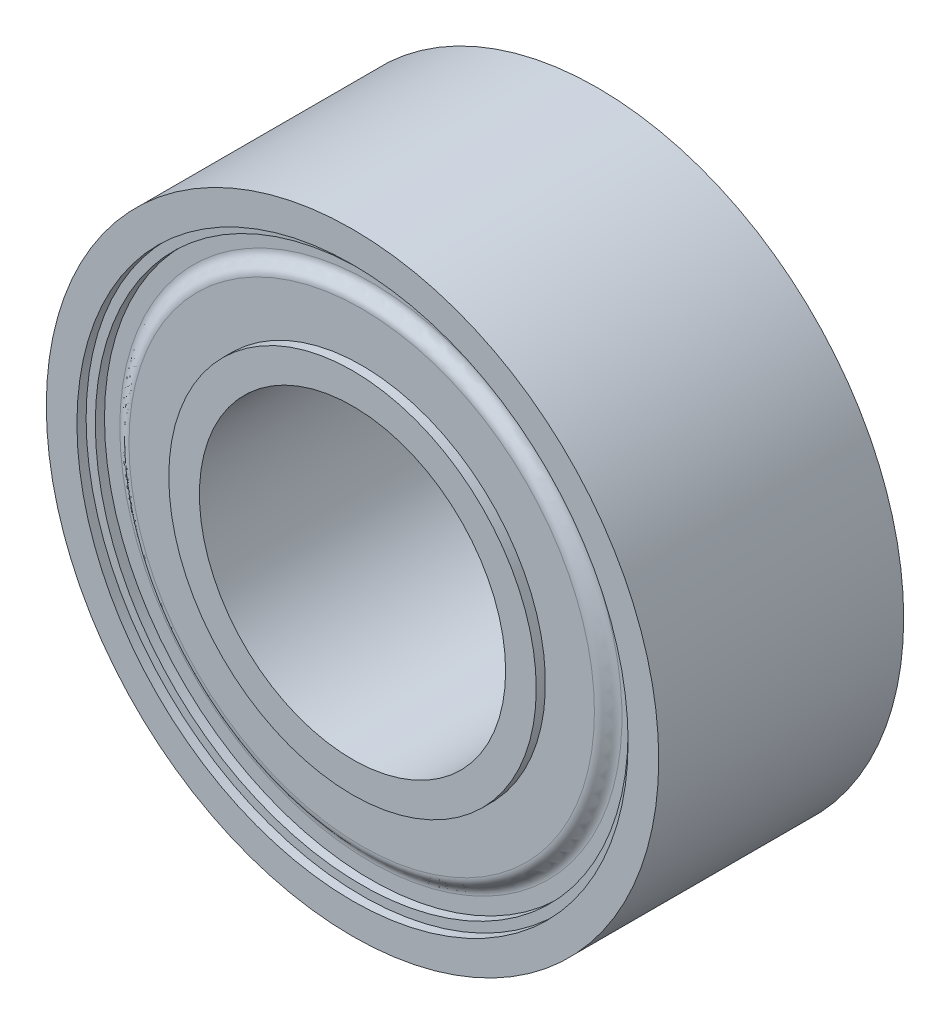
ISO-10303-21;
HEADER;
FILE_DESCRIPTION(('STEP AP214'),'2;1');
FILE_NAME('part.step','',(''),(''),'','','');
FILE_SCHEMA(('AUTOMOTIVE_DESIGN { 1 0 10303 214 1 1 1 1 }'));
ENDSEC;
DATA;
#1=APPLICATION_CONTEXT('core data for automotive mechanical design processes');
#2=APPLICATION_PROTOCOL_DEFINITION('international standard','automotive_design',2000,#1);
#3=PRODUCT_CONTEXT('',#1,'mechanical');
#4=PRODUCT('Part','Part','',(#3));
#5=PRODUCT_RELATED_PRODUCT_CATEGORY('part','',(#4));
#6=PRODUCT_DEFINITION_FORMATION('','',#4);
#7=PRODUCT_DEFINITION_CONTEXT('part definition',#1,'design');
#8=PRODUCT_DEFINITION('design','',#6,#7);
#9=PRODUCT_DEFINITION_SHAPE('','',#8);
#10=(LENGTH_UNIT() NAMED_UNIT(*) SI_UNIT(.MILLI.,.METRE.));
#11=(NAMED_UNIT(*) PLANE_ANGLE_UNIT() SI_UNIT($,.RADIAN.));
#12=(NAMED_UNIT(*) SI_UNIT($,.STERADIAN.) SOLID_ANGLE_UNIT());
#13=UNCERTAINTY_MEASURE_WITH_UNIT(LENGTH_MEASURE(1.E-05),#10,'distance_accuracy_value','');
#14=(GEOMETRIC_REPRESENTATION_CONTEXT(3) GLOBAL_UNCERTAINTY_ASSIGNED_CONTEXT((#13)) GLOBAL_UNIT_ASSIGNED_CONTEXT((#10,
#11,#12)) REPRESENTATION_CONTEXT('',''));
#15=CARTESIAN_POINT('',(0.,0.,0.));
#16=DIRECTION('',(0.,0.,1.));
#17=DIRECTION('',(1.,0.,0.));
#18=AXIS2_PLACEMENT_3D('',#15,#16,#17);
#19=CARTESIAN_POINT('',(0.,0.,2.));
#20=DIRECTION('',(0.,0.,-1.));
#21=DIRECTION('',(-1.,0.,0.));
#22=AXIS2_PLACEMENT_3D('',#19,#20,#21);
#23=CYLINDRICAL_SURFACE('',#22,4.5);
#24=CARTESIAN_POINT('',(0.,0.,-2.));
#25=DIRECTION('',(0.,0.,1.));
#26=DIRECTION('',(1.,0.,0.));
#27=AXIS2_PLACEMENT_3D('',#24,#25,#26);
#28=CIRCLE('',#27,4.5);
#29=CARTESIAN_POINT('',(4.5,0.,-2.));
#30=VERTEX_POINT('',#29);
#31=EDGE_CURVE('E63',#30,#30,#28,.T.);
#32=ORIENTED_EDGE('',*,*,#31,.F.);
#33=EDGE_LOOP('',(#32));
#34=FACE_BOUND('',#33,.T.);
#35=CARTESIAN_POINT('',(0.,0.,-1.85));
#36=DIRECTION('',(0.,0.,-1.));
#37=DIRECTION('',(-1.,0.,0.));
#38=AXIS2_PLACEMENT_3D('',#35,#36,#37);
#39=CIRCLE('',#38,4.5);
#40=CARTESIAN_POINT('',(-4.5,0.,-1.85));
#41=VERTEX_POINT('',#40);
#42=EDGE_CURVE('E104',#41,#41,#39,.T.);
#43=ORIENTED_EDGE('',*,*,#42,.F.);
#44=EDGE_LOOP('',(#43));
#45=FACE_BOUND('',#44,.T.);
#46=ADVANCED_FACE('F47',(#34,#45),#23,.F.);
#47=CARTESIAN_POINT('',(0.,0.,2.));
#48=DIRECTION('',(0.,0.,1.));
#49=DIRECTION('',(1.,0.,0.));
#50=AXIS2_PLACEMENT_3D('',#47,#48,#49);
#51=CIRCLE('',#50,4.5);
#52=CARTESIAN_POINT('',(4.5,0.,2.));
#53=VERTEX_POINT('',#52);
#54=EDGE_CURVE('E55',#53,#53,#51,.T.);
#55=ORIENTED_EDGE('',*,*,#54,.T.);
#56=EDGE_LOOP('',(#55));
#57=FACE_BOUND('',#56,.T.);
#58=CARTESIAN_POINT('',(0.,0.,1.85));
#59=DIRECTION('',(0.,0.,-1.));
#60=DIRECTION('',(-1.,0.,0.));
#61=AXIS2_PLACEMENT_3D('',#58,#59,#60);
#62=CIRCLE('',#61,4.5);
#63=CARTESIAN_POINT('',(-4.5,0.,1.85));
#64=VERTEX_POINT('',#63);
#65=EDGE_CURVE('E108',#64,#64,#62,.T.);
#66=ORIENTED_EDGE('',*,*,#65,.T.);
#67=EDGE_LOOP('',(#66));
#68=FACE_BOUND('',#67,.T.);
#69=ADVANCED_FACE('F152',(#57,#68),#23,.F.);
#70=CARTESIAN_POINT('',(0.,0.,2.));
#71=DIRECTION('',(0.,0.,-1.));
#72=DIRECTION('',(-1.,0.,0.));
#73=AXIS2_PLACEMENT_3D('',#70,#71,#72);
#74=CYLINDRICAL_SURFACE('',#73,5.);
#75=CARTESIAN_POINT('',(0.,0.,2.));
#76=DIRECTION('',(0.,0.,1.));
#77=DIRECTION('',(1.,0.,0.));
#78=AXIS2_PLACEMENT_3D('',#75,#76,#77);
#79=CIRCLE('',#78,5.);
#80=CARTESIAN_POINT('',(5.,0.,2.));
#81=VERTEX_POINT('',#80);
#82=EDGE_CURVE('E11',#81,#81,#79,.T.);
#83=ORIENTED_EDGE('',*,*,#82,.F.);
#84=EDGE_LOOP('',(#83));
#85=FACE_BOUND('',#84,.T.);
#86=CARTESIAN_POINT('',(0.,0.,-2.));
#87=DIRECTION('',(0.,0.,1.));
#88=DIRECTION('',(1.,0.,0.));
#89=AXIS2_PLACEMENT_3D('',#86,#87,#88);
#90=CIRCLE('',#89,5.);
#91=CARTESIAN_POINT('',(5.,0.,-2.));
#92=VERTEX_POINT('',#91);
#93=EDGE_CURVE('E50',#92,#92,#90,.T.);
#94=ORIENTED_EDGE('',*,*,#93,.T.);
#95=EDGE_LOOP('',(#94));
#96=FACE_BOUND('',#95,.T.);
#97=ADVANCED_FACE('F148',(#85,#96),#74,.T.);
#98=CARTESIAN_POINT('',(0.,0.,2.));
#99=DIRECTION('',(0.,0.,1.));
#100=DIRECTION('',(1.,0.,0.));
#101=AXIS2_PLACEMENT_3D('',#98,#99,#100);
#102=PLANE('',#101);
#103=ORIENTED_EDGE('',*,*,#54,.F.);
#104=EDGE_LOOP('',(#103));
#105=FACE_BOUND('',#104,.T.);
#106=ORIENTED_EDGE('',*,*,#82,.T.);
#107=EDGE_LOOP('',(#106));
#108=FACE_BOUND('',#107,.T.);
#109=ADVANCED_FACE('F145',(#105,#108),#102,.T.);
#110=CARTESIAN_POINT('',(0.,0.,-2.));
#111=DIRECTION('',(0.,0.,1.));
#112=DIRECTION('',(1.,0.,0.));
#113=AXIS2_PLACEMENT_3D('',#110,#111,#112);
#114=PLANE('',#113);
#115=ORIENTED_EDGE('',*,*,#31,.T.);
#116=EDGE_LOOP('',(#115));
#117=FACE_BOUND('',#116,.T.);
#118=ORIENTED_EDGE('',*,*,#93,.F.);
#119=EDGE_LOOP('',(#118));
#120=FACE_BOUND('',#119,.T.);
#121=ADVANCED_FACE('F143',(#117,#120),#114,.F.);
#122=CARTESIAN_POINT('',(0.,0.,-2.));
#123=DIRECTION('',(0.,0.,-1.));
#124=DIRECTION('',(-1.,0.,0.));
#125=AXIS2_PLACEMENT_3D('',#122,#123,#124);
#126=CYLINDRICAL_SURFACE('',#125,4.35);
#127=CARTESIAN_POINT('',(0.,0.,1.85));
#128=DIRECTION('',(0.,0.,-1.));
#129=DIRECTION('',(-1.,0.,0.));
#130=AXIS2_PLACEMENT_3D('',#127,#128,#129);
#131=CIRCLE('',#130,4.35);
#132=CARTESIAN_POINT('',(-4.35,0.,1.85));
#133=VERTEX_POINT('',#132);
#134=EDGE_CURVE('E112',#133,#133,#131,.T.);
#135=ORIENTED_EDGE('',*,*,#134,.F.);
#136=EDGE_LOOP('',(#135));
#137=FACE_BOUND('',#136,.T.);
#138=CARTESIAN_POINT('',(0.,0.,1.7));
#139=DIRECTION('',(0.,0.,-1.));
#140=DIRECTION('',(-1.,0.,0.));
#141=AXIS2_PLACEMENT_3D('',#138,#139,#140);
#142=CIRCLE('',#141,4.35);
#143=CARTESIAN_POINT('',(-4.35,0.,1.7));
#144=VERTEX_POINT('',#143);
#145=EDGE_CURVE('E66',#144,#144,#142,.T.);
#146=ORIENTED_EDGE('',*,*,#145,.T.);
#147=EDGE_LOOP('',(#146));
#148=FACE_BOUND('',#147,.T.);
#149=ADVANCED_FACE('F139',(#137,#148),#126,.F.);
#150=CARTESIAN_POINT('',(4.35,0.,1.7));
#151=DIRECTION('',(0.,0.,-1.));
#152=DIRECTION('',(-1.,0.,0.));
#153=AXIS2_PLACEMENT_3D('',#150,#151,#152);
#154=PLANE('',#153);
#155=ORIENTED_EDGE('',*,*,#145,.F.);
#156=EDGE_LOOP('',(#155));
#157=FACE_BOUND('',#156,.T.);
#158=CARTESIAN_POINT('',(0.,0.,1.7));
#159=DIRECTION('',(0.,0.,-1.));
#160=DIRECTION('',(-1.,0.,0.));
#161=AXIS2_PLACEMENT_3D('',#158,#159,#160);
#162=CIRCLE('',#161,4.1);
#163=CARTESIAN_POINT('',(-4.1,0.,1.7));
#164=VERTEX_POINT('',#163);
#165=EDGE_CURVE('E73',#164,#164,#162,.T.);
#166=ORIENTED_EDGE('',*,*,#165,.T.);
#167=EDGE_LOOP('',(#166));
#168=FACE_BOUND('',#167,.T.);
#169=ADVANCED_FACE('F134',(#157,#168),#154,.F.);
#170=CARTESIAN_POINT('',(3.8,0.,1.85));
#171=CARTESIAN_POINT('',(3.95,0.,1.85));
#172=CARTESIAN_POINT('',(3.95,0.,1.7));
#173=CARTESIAN_POINT('',(4.1,0.,1.7));
#174=B_SPLINE_CURVE_WITH_KNOTS('',3,(#170,#171,#172,#173),.UNSPECIFIED.,.F.,.F.,(4,4),(0.,1.),.UNSPECIFIED.);
#175=CARTESIAN_POINT('',(0.,0.,-2.));
#176=DIRECTION('',(0.,0.,-1.));
#177=AXIS1_PLACEMENT('',#175,#176);
#178=SURFACE_OF_REVOLUTION('',#174,#177);
#179=ORIENTED_EDGE('',*,*,#165,.F.);
#180=EDGE_LOOP('',(#179));
#181=FACE_BOUND('',#180,.T.);
#182=CARTESIAN_POINT('',(0.,0.,1.85));
#183=DIRECTION('',(0.,0.,-1.));
#184=DIRECTION('',(-1.,0.,0.));
#185=AXIS2_PLACEMENT_3D('',#182,#183,#184);
#186=CIRCLE('',#185,3.8);
#187=CARTESIAN_POINT('',(-3.8,0.,1.85));
#188=VERTEX_POINT('',#187);
#189=EDGE_CURVE('E78',#188,#188,#186,.T.);
#190=ORIENTED_EDGE('',*,*,#189,.T.);
#191=EDGE_LOOP('',(#190));
#192=FACE_BOUND('',#191,.T.);
#193=ADVANCED_FACE('F129',(#181,#192),#178,.T.);
#194=CARTESIAN_POINT('',(3.,0.,1.85));
#195=DIRECTION('',(0.,0.,-1.));
#196=DIRECTION('',(-1.,0.,0.));
#197=AXIS2_PLACEMENT_3D('',#194,#195,#196);
#198=PLANE('',#197);
#199=ORIENTED_EDGE('',*,*,#189,.F.);
#200=EDGE_LOOP('',(#199));
#201=FACE_BOUND('',#200,.T.);
#202=CARTESIAN_POINT('',(0.,0.,1.85));
#203=DIRECTION('',(0.,0.,-1.));
#204=DIRECTION('',(-1.,0.,0.));
#205=AXIS2_PLACEMENT_3D('',#202,#203,#204);
#206=CIRCLE('',#205,3.);
#207=CARTESIAN_POINT('',(-3.,0.,1.85));
#208=VERTEX_POINT('',#207);
#209=EDGE_CURVE('E116',#208,#208,#206,.F.);
#210=ORIENTED_EDGE('',*,*,#209,.F.);
#211=EDGE_LOOP('',(#210));
#212=FACE_BOUND('',#211,.T.);
#213=ADVANCED_FACE('F133',(#201,#212),#198,.F.);
#214=CARTESIAN_POINT('',(3.,0.,-1.85));
#215=DIRECTION('',(0.,0.,1.));
#216=DIRECTION('',(1.,0.,0.));
#217=AXIS2_PLACEMENT_3D('',#214,#215,#216);
#218=PLANE('',#217);
#219=CARTESIAN_POINT('',(0.,0.,-1.85));
#220=DIRECTION('',(0.,0.,-1.));
#221=DIRECTION('',(-1.,0.,0.));
#222=AXIS2_PLACEMENT_3D('',#219,#220,#221);
#223=CIRCLE('',#222,3.);
#224=CARTESIAN_POINT('',(-3.,0.,-1.85));
#225=VERTEX_POINT('',#224);
#226=EDGE_CURVE('E84',#225,#225,#223,.T.);
#227=ORIENTED_EDGE('',*,*,#226,.F.);
#228=EDGE_LOOP('',(#227));
#229=FACE_BOUND('',#228,.T.);
#230=CARTESIAN_POINT('',(0.,0.,-1.85));
#231=DIRECTION('',(0.,0.,-1.));
#232=DIRECTION('',(-1.,0.,0.));
#233=AXIS2_PLACEMENT_3D('',#230,#231,#232);
#234=CIRCLE('',#233,3.8);
#235=CARTESIAN_POINT('',(-3.8,0.,-1.85));
#236=VERTEX_POINT('',#235);
#237=EDGE_CURVE('E88',#236,#236,#234,.T.);
#238=ORIENTED_EDGE('',*,*,#237,.T.);
#239=EDGE_LOOP('',(#238));
#240=FACE_BOUND('',#239,.T.);
#241=ADVANCED_FACE('F190',(#229,#240),#218,.F.);
#242=CARTESIAN_POINT('',(4.1,0.,-1.7));
#243=CARTESIAN_POINT('',(3.95,0.,-1.7));
#244=CARTESIAN_POINT('',(3.95,0.,-1.85));
#245=CARTESIAN_POINT('',(3.8,0.,-1.85));
#246=B_SPLINE_CURVE_WITH_KNOTS('',3,(#242,#243,#244,#245),.UNSPECIFIED.,.F.,.F.,(4,4),(0.,1.),.UNSPECIFIED.);
#247=CARTESIAN_POINT('',(0.,0.,-2.));
#248=DIRECTION('',(0.,0.,-1.));
#249=AXIS1_PLACEMENT('',#247,#248);
#250=SURFACE_OF_REVOLUTION('',#246,#249);
#251=ORIENTED_EDGE('',*,*,#237,.F.);
#252=EDGE_LOOP('',(#251));
#253=FACE_BOUND('',#252,.T.);
#254=CARTESIAN_POINT('',(0.,0.,-1.7));
#255=DIRECTION('',(0.,0.,-1.));
#256=DIRECTION('',(-1.,0.,0.));
#257=AXIS2_PLACEMENT_3D('',#254,#255,#256);
#258=CIRCLE('',#257,4.1);
#259=CARTESIAN_POINT('',(-4.1,0.,-1.7));
#260=VERTEX_POINT('',#259);
#261=EDGE_CURVE('E92',#260,#260,#258,.T.);
#262=ORIENTED_EDGE('',*,*,#261,.T.);
#263=EDGE_LOOP('',(#262));
#264=FACE_BOUND('',#263,.T.);
#265=ADVANCED_FACE('F187',(#253,#264),#250,.T.);
#266=CARTESIAN_POINT('',(4.35,0.,-1.7));
#267=DIRECTION('',(0.,0.,1.));
#268=DIRECTION('',(1.,0.,0.));
#269=AXIS2_PLACEMENT_3D('',#266,#267,#268);
#270=PLANE('',#269);
#271=ORIENTED_EDGE('',*,*,#261,.F.);
#272=EDGE_LOOP('',(#271));
#273=FACE_BOUND('',#272,.T.);
#274=CARTESIAN_POINT('',(0.,0.,-1.7));
#275=DIRECTION('',(0.,0.,-1.));
#276=DIRECTION('',(-1.,0.,0.));
#277=AXIS2_PLACEMENT_3D('',#274,#275,#276);
#278=CIRCLE('',#277,4.35);
#279=CARTESIAN_POINT('',(-4.35,0.,-1.7));
#280=VERTEX_POINT('',#279);
#281=EDGE_CURVE('E96',#280,#280,#278,.T.);
#282=ORIENTED_EDGE('',*,*,#281,.T.);
#283=EDGE_LOOP('',(#282));
#284=FACE_BOUND('',#283,.T.);
#285=ADVANCED_FACE('F179',(#273,#284),#270,.F.);
#286=CARTESIAN_POINT('',(0.,0.,-2.));
#287=DIRECTION('',(0.,0.,-1.));
#288=DIRECTION('',(-1.,0.,0.));
#289=AXIS2_PLACEMENT_3D('',#286,#287,#288);
#290=CYLINDRICAL_SURFACE('',#289,4.35);
#291=ORIENTED_EDGE('',*,*,#281,.F.);
#292=EDGE_LOOP('',(#291));
#293=FACE_BOUND('',#292,.T.);
#294=CARTESIAN_POINT('',(0.,0.,-1.85));
#295=DIRECTION('',(0.,0.,-1.));
#296=DIRECTION('',(-1.,0.,0.));
#297=AXIS2_PLACEMENT_3D('',#294,#295,#296);
#298=CIRCLE('',#297,4.35);
#299=CARTESIAN_POINT('',(-4.35,0.,-1.85));
#300=VERTEX_POINT('',#299);
#301=EDGE_CURVE('E100',#300,#300,#298,.T.);
#302=ORIENTED_EDGE('',*,*,#301,.T.);
#303=EDGE_LOOP('',(#302));
#304=FACE_BOUND('',#303,.T.);
#305=ADVANCED_FACE('F169',(#293,#304),#290,.F.);
#306=CARTESIAN_POINT('',(4.5,0.,-1.85));
#307=DIRECTION('',(0.,0.,1.));
#308=DIRECTION('',(1.,0.,0.));
#309=AXIS2_PLACEMENT_3D('',#306,#307,#308);
#310=PLANE('',#309);
#311=ORIENTED_EDGE('',*,*,#301,.F.);
#312=EDGE_LOOP('',(#311));
#313=FACE_BOUND('',#312,.T.);
#314=ORIENTED_EDGE('',*,*,#42,.T.);
#315=EDGE_LOOP('',(#314));
#316=FACE_BOUND('',#315,.T.);
#317=ADVANCED_FACE('F166',(#313,#316),#310,.F.);
#318=CARTESIAN_POINT('',(4.5,0.,1.85));
#319=DIRECTION('',(0.,0.,-1.));
#320=DIRECTION('',(-1.,0.,0.));
#321=AXIS2_PLACEMENT_3D('',#318,#319,#320);
#322=PLANE('',#321);
#323=ORIENTED_EDGE('',*,*,#65,.F.);
#324=EDGE_LOOP('',(#323));
#325=FACE_BOUND('',#324,.T.);
#326=ORIENTED_EDGE('',*,*,#134,.T.);
#327=EDGE_LOOP('',(#326));
#328=FACE_BOUND('',#327,.T.);
#329=ADVANCED_FACE('F168',(#325,#328),#322,.F.);
#330=CARTESIAN_POINT('',(0.,0.,2.));
#331=DIRECTION('',(0.,0.,-1.));
#332=DIRECTION('',(-1.,0.,0.));
#333=AXIS2_PLACEMENT_3D('',#330,#331,#332);
#334=CYLINDRICAL_SURFACE('',#333,3.);
#335=CARTESIAN_POINT('',(0.,0.,2.));
#336=DIRECTION('',(0.,0.,1.));
#337=DIRECTION('',(1.,0.,0.));
#338=AXIS2_PLACEMENT_3D('',#335,#336,#337);
#339=CIRCLE('',#338,3.);
#340=CARTESIAN_POINT('',(3.,0.,2.));
#341=VERTEX_POINT('',#340);
#342=EDGE_CURVE('E235',#341,#341,#339,.T.);
#343=ORIENTED_EDGE('',*,*,#342,.F.);
#344=EDGE_LOOP('',(#343));
#345=FACE_BOUND('',#344,.T.);
#346=ORIENTED_EDGE('',*,*,#209,.T.);
#347=EDGE_LOOP('',(#346));
#348=FACE_BOUND('',#347,.T.);
#349=ADVANCED_FACE('F176',(#345,#348),#334,.T.);
#350=CARTESIAN_POINT('',(0.,0.,-2.));
#351=DIRECTION('',(0.,0.,1.));
#352=DIRECTION('',(1.,0.,0.));
#353=AXIS2_PLACEMENT_3D('',#350,#351,#352);
#354=CIRCLE('',#353,3.);
#355=CARTESIAN_POINT('',(3.,0.,-2.));
#356=VERTEX_POINT('',#355);
#357=EDGE_CURVE('E241',#356,#356,#354,.T.);
#358=ORIENTED_EDGE('',*,*,#357,.T.);
#359=EDGE_LOOP('',(#358));
#360=FACE_BOUND('',#359,.T.);
#361=ORIENTED_EDGE('',*,*,#226,.T.);
#362=EDGE_LOOP('',(#361));
#363=FACE_BOUND('',#362,.T.);
#364=ADVANCED_FACE('F207',(#360,#363),#334,.T.);
#365=CARTESIAN_POINT('',(0.,0.,2.));
#366=DIRECTION('',(0.,0.,-1.));
#367=DIRECTION('',(-1.,0.,0.));
#368=AXIS2_PLACEMENT_3D('',#365,#366,#367);
#369=CYLINDRICAL_SURFACE('',#368,2.5);
#370=CARTESIAN_POINT('',(0.,0.,2.));
#371=DIRECTION('',(0.,0.,1.));
#372=DIRECTION('',(1.,0.,0.));
#373=AXIS2_PLACEMENT_3D('',#370,#371,#372);
#374=CIRCLE('',#373,2.5);
#375=CARTESIAN_POINT('',(2.5,0.,2.));
#376=VERTEX_POINT('',#375);
#377=EDGE_CURVE('E232',#376,#376,#374,.T.);
#378=ORIENTED_EDGE('',*,*,#377,.T.);
#379=EDGE_LOOP('',(#378));
#380=FACE_BOUND('',#379,.T.);
#381=CARTESIAN_POINT('',(0.,0.,-2.));
#382=DIRECTION('',(0.,0.,1.));
#383=DIRECTION('',(1.,0.,0.));
#384=AXIS2_PLACEMENT_3D('',#381,#382,#383);
#385=CIRCLE('',#384,2.5);
#386=CARTESIAN_POINT('',(2.5,0.,-2.));
#387=VERTEX_POINT('',#386);
#388=EDGE_CURVE('E244',#387,#387,#385,.T.);
#389=ORIENTED_EDGE('',*,*,#388,.F.);
#390=EDGE_LOOP('',(#389));
#391=FACE_BOUND('',#390,.T.);
#392=ADVANCED_FACE('F209',(#380,#391),#369,.F.);
#393=CARTESIAN_POINT('',(0.,0.,2.));
#394=DIRECTION('',(0.,0.,1.));
#395=DIRECTION('',(1.,0.,0.));
#396=AXIS2_PLACEMENT_3D('',#393,#394,#395);
#397=PLANE('',#396);
#398=ORIENTED_EDGE('',*,*,#377,.F.);
#399=EDGE_LOOP('',(#398));
#400=FACE_BOUND('',#399,.T.);
#401=ORIENTED_EDGE('',*,*,#342,.T.);
#402=EDGE_LOOP('',(#401));
#403=FACE_BOUND('',#402,.T.);
#404=ADVANCED_FACE('F216',(#400,#403),#397,.T.);
#405=CARTESIAN_POINT('',(0.,0.,-2.));
#406=DIRECTION('',(0.,0.,1.));
#407=DIRECTION('',(1.,0.,0.));
#408=AXIS2_PLACEMENT_3D('',#405,#406,#407);
#409=PLANE('',#408);
#410=ORIENTED_EDGE('',*,*,#388,.T.);
#411=EDGE_LOOP('',(#410));
#412=FACE_BOUND('',#411,.T.);
#413=ORIENTED_EDGE('',*,*,#357,.F.);
#414=EDGE_LOOP('',(#413));
#415=FACE_BOUND('',#414,.T.);
#416=ADVANCED_FACE('F221',(#412,#415),#409,.F.);
#417=CLOSED_SHELL('',(#46,#69,#97,#109,#121,#149,#169,#193,#213,#241,#265,#285,#305,#317,#329,
#349,#364,#392,#404,#416));
#418=MANIFOLD_SOLID_BREP('B2',#417);
#419=ADVANCED_BREP_SHAPE_REPRESENTATION('',(#18,#418),#14);
#420=SHAPE_DEFINITION_REPRESENTATION(#9,#419);
ENDSEC;
END-ISO-10303-21;
